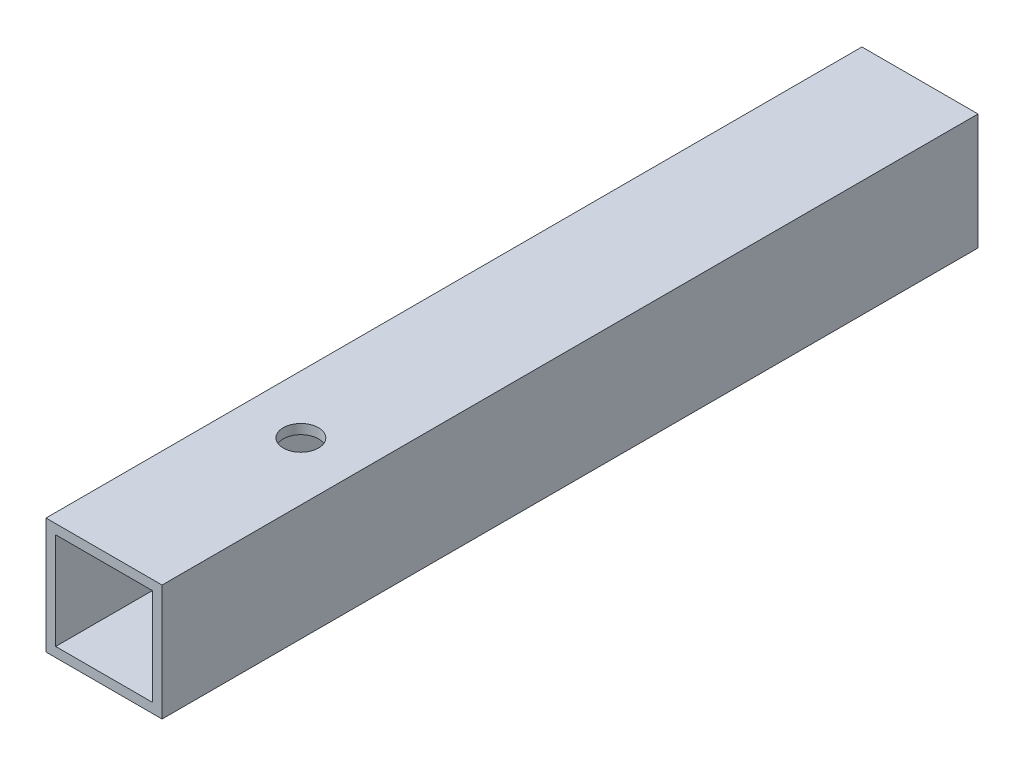
ISO-10303-21;
HEADER;
FILE_DESCRIPTION(('STEP AP214'),'2;1');
FILE_NAME('part.step','',(''),(''),'','','');
FILE_SCHEMA(('AUTOMOTIVE_DESIGN { 1 0 10303 214 1 1 1 1 }'));
ENDSEC;
DATA;
#1=APPLICATION_CONTEXT('core data for automotive mechanical design processes');
#2=APPLICATION_PROTOCOL_DEFINITION('international standard','automotive_design',2000,#1);
#3=PRODUCT_CONTEXT('',#1,'mechanical');
#4=PRODUCT('Part','Part','',(#3));
#5=PRODUCT_RELATED_PRODUCT_CATEGORY('part','',(#4));
#6=PRODUCT_DEFINITION_FORMATION('','',#4);
#7=PRODUCT_DEFINITION_CONTEXT('part definition',#1,'design');
#8=PRODUCT_DEFINITION('design','',#6,#7);
#9=PRODUCT_DEFINITION_SHAPE('','',#8);
#10=(LENGTH_UNIT() NAMED_UNIT(*) SI_UNIT(.MILLI.,.METRE.));
#11=(NAMED_UNIT(*) PLANE_ANGLE_UNIT() SI_UNIT($,.RADIAN.));
#12=(NAMED_UNIT(*) SI_UNIT($,.STERADIAN.) SOLID_ANGLE_UNIT());
#13=UNCERTAINTY_MEASURE_WITH_UNIT(LENGTH_MEASURE(1.E-05),#10,'distance_accuracy_value','');
#14=(GEOMETRIC_REPRESENTATION_CONTEXT(3) GLOBAL_UNCERTAINTY_ASSIGNED_CONTEXT((#13)) GLOBAL_UNIT_ASSIGNED_CONTEXT((#10,
#11,#12)) REPRESENTATION_CONTEXT('',''));
#15=CARTESIAN_POINT('',(0.,0.,0.));
#16=DIRECTION('',(0.,0.,1.));
#17=DIRECTION('',(1.,0.,0.));
#18=AXIS2_PLACEMENT_3D('',#15,#16,#17);
#19=CARTESIAN_POINT('',(0.,0.,66.951599904));
#20=DIRECTION('',(0.,0.,1.));
#21=DIRECTION('',(1.,0.,0.));
#22=AXIS2_PLACEMENT_3D('',#19,#20,#21);
#23=PLANE('',#22);
#24=DIRECTION('',(1.,0.,0.));
#25=VECTOR('',#24,1.);
#26=CARTESIAN_POINT('',(9.525,-9.525,66.951599904));
#27=LINE('',#26,#25);
#28=CARTESIAN_POINT('',(-9.525,-9.525,66.951599904));
#29=VERTEX_POINT('',#28);
#30=CARTESIAN_POINT('',(9.525,-9.525,66.951599904));
#31=VERTEX_POINT('',#30);
#32=EDGE_CURVE('E139',#29,#31,#27,.T.);
#33=ORIENTED_EDGE('',*,*,#32,.T.);
#34=DIRECTION('',(0.,1.,0.));
#35=VECTOR('',#34,1.);
#36=CARTESIAN_POINT('',(9.525,9.525,66.951599904));
#37=LINE('',#36,#35);
#38=CARTESIAN_POINT('',(9.525,9.525,66.951599904));
#39=VERTEX_POINT('',#38);
#40=EDGE_CURVE('E142',#31,#39,#37,.T.);
#41=ORIENTED_EDGE('',*,*,#40,.T.);
#42=DIRECTION('',(-1.,0.,0.));
#43=VECTOR('',#42,1.);
#44=CARTESIAN_POINT('',(9.525,9.525,66.951599904));
#45=LINE('',#44,#43);
#46=CARTESIAN_POINT('',(-9.525,9.525,66.951599904));
#47=VERTEX_POINT('',#46);
#48=EDGE_CURVE('E145',#39,#47,#45,.T.);
#49=ORIENTED_EDGE('',*,*,#48,.T.);
#50=DIRECTION('',(0.,-1.,0.));
#51=VECTOR('',#50,1.);
#52=CARTESIAN_POINT('',(-9.525,9.525,66.951599904));
#53=LINE('',#52,#51);
#54=EDGE_CURVE('E147',#47,#29,#53,.T.);
#55=ORIENTED_EDGE('',*,*,#54,.T.);
#56=EDGE_LOOP('',(#33,#41,#49,#55));
#57=FACE_BOUND('',#56,.T.);
#58=DIRECTION('',(0.,1.,0.));
#59=VECTOR('',#58,1.);
#60=CARTESIAN_POINT('',(7.9375,7.9375,66.951599904));
#61=LINE('',#60,#59);
#62=CARTESIAN_POINT('',(7.9375,-7.9375,66.951599904));
#63=VERTEX_POINT('',#62);
#64=CARTESIAN_POINT('',(7.9375,7.9375,66.951599904));
#65=VERTEX_POINT('',#64);
#66=EDGE_CURVE('E109',#63,#65,#61,.T.);
#67=ORIENTED_EDGE('',*,*,#66,.F.);
#68=DIRECTION('',(1.,0.,0.));
#69=VECTOR('',#68,1.);
#70=CARTESIAN_POINT('',(7.9375,-7.9375,66.951599904));
#71=LINE('',#70,#69);
#72=CARTESIAN_POINT('',(-7.9375,-7.9375,66.951599904));
#73=VERTEX_POINT('',#72);
#74=EDGE_CURVE('E101',#73,#63,#71,.T.);
#75=ORIENTED_EDGE('',*,*,#74,.F.);
#76=DIRECTION('',(0.,-1.,0.));
#77=VECTOR('',#76,1.);
#78=CARTESIAN_POINT('',(-7.9375,7.9375,66.951599904));
#79=LINE('',#78,#77);
#80=CARTESIAN_POINT('',(-7.9375,7.9375,66.951599904));
#81=VERTEX_POINT('',#80);
#82=EDGE_CURVE('E123',#81,#73,#79,.T.);
#83=ORIENTED_EDGE('',*,*,#82,.F.);
#84=DIRECTION('',(-1.,0.,0.));
#85=VECTOR('',#84,1.);
#86=CARTESIAN_POINT('',(7.9375,7.9375,66.951599904));
#87=LINE('',#86,#85);
#88=EDGE_CURVE('E121',#65,#81,#87,.T.);
#89=ORIENTED_EDGE('',*,*,#88,.F.);
#90=EDGE_LOOP('',(#67,#75,#83,#89));
#91=FACE_BOUND('',#90,.T.);
#92=ADVANCED_FACE('F35',(#57,#91),#23,.T.);
#93=CARTESIAN_POINT('',(0.,0.,-66.951599904));
#94=DIRECTION('',(0.,0.,1.));
#95=DIRECTION('',(1.,0.,0.));
#96=AXIS2_PLACEMENT_3D('',#93,#94,#95);
#97=PLANE('',#96);
#98=DIRECTION('',(1.,0.,0.));
#99=VECTOR('',#98,1.);
#100=CARTESIAN_POINT('',(9.525,-9.525,-66.951599904));
#101=LINE('',#100,#99);
#102=CARTESIAN_POINT('',(-9.525,-9.525,-66.951599904));
#103=VERTEX_POINT('',#102);
#104=CARTESIAN_POINT('',(9.525,-9.525,-66.951599904));
#105=VERTEX_POINT('',#104);
#106=EDGE_CURVE('E117',#103,#105,#101,.T.);
#107=ORIENTED_EDGE('',*,*,#106,.F.);
#108=DIRECTION('',(0.,-1.,0.));
#109=VECTOR('',#108,1.);
#110=CARTESIAN_POINT('',(-9.525,9.525,-66.951599904));
#111=LINE('',#110,#109);
#112=CARTESIAN_POINT('',(-9.525,9.525,-66.951599904));
#113=VERTEX_POINT('',#112);
#114=EDGE_CURVE('E143',#113,#103,#111,.T.);
#115=ORIENTED_EDGE('',*,*,#114,.F.);
#116=DIRECTION('',(-1.,0.,0.));
#117=VECTOR('',#116,1.);
#118=CARTESIAN_POINT('',(9.525,9.525,-66.951599904));
#119=LINE('',#118,#117);
#120=CARTESIAN_POINT('',(9.525,9.525,-66.951599904));
#121=VERTEX_POINT('',#120);
#122=EDGE_CURVE('E154',#121,#113,#119,.T.);
#123=ORIENTED_EDGE('',*,*,#122,.F.);
#124=DIRECTION('',(0.,1.,0.));
#125=VECTOR('',#124,1.);
#126=CARTESIAN_POINT('',(9.525,9.525,-66.951599904));
#127=LINE('',#126,#125);
#128=EDGE_CURVE('E152',#105,#121,#127,.T.);
#129=ORIENTED_EDGE('',*,*,#128,.F.);
#130=EDGE_LOOP('',(#107,#115,#123,#129));
#131=FACE_BOUND('',#130,.T.);
#132=DIRECTION('',(1.,0.,0.));
#133=VECTOR('',#132,1.);
#134=CARTESIAN_POINT('',(7.9375,-7.9375,-66.951599904));
#135=LINE('',#134,#133);
#136=CARTESIAN_POINT('',(-7.9375,-7.9375,-66.951599904));
#137=VERTEX_POINT('',#136);
#138=CARTESIAN_POINT('',(7.9375,-7.9375,-66.951599904));
#139=VERTEX_POINT('',#138);
#140=EDGE_CURVE('E59',#137,#139,#135,.T.);
#141=ORIENTED_EDGE('',*,*,#140,.T.);
#142=DIRECTION('',(0.,1.,0.));
#143=VECTOR('',#142,1.);
#144=CARTESIAN_POINT('',(7.9375,7.9375,-66.951599904));
#145=LINE('',#144,#143);
#146=CARTESIAN_POINT('',(7.9375,7.9375,-66.951599904));
#147=VERTEX_POINT('',#146);
#148=EDGE_CURVE('E116',#139,#147,#145,.T.);
#149=ORIENTED_EDGE('',*,*,#148,.T.);
#150=DIRECTION('',(-1.,0.,0.));
#151=VECTOR('',#150,1.);
#152=CARTESIAN_POINT('',(7.9375,7.9375,-66.951599904));
#153=LINE('',#152,#151);
#154=CARTESIAN_POINT('',(-7.9375,7.9375,-66.951599904));
#155=VERTEX_POINT('',#154);
#156=EDGE_CURVE('E131',#147,#155,#153,.T.);
#157=ORIENTED_EDGE('',*,*,#156,.T.);
#158=DIRECTION('',(0.,-1.,0.));
#159=VECTOR('',#158,1.);
#160=CARTESIAN_POINT('',(-7.9375,7.9375,-66.951599904));
#161=LINE('',#160,#159);
#162=EDGE_CURVE('E110',#155,#137,#161,.T.);
#163=ORIENTED_EDGE('',*,*,#162,.T.);
#164=EDGE_LOOP('',(#141,#149,#157,#163));
#165=FACE_BOUND('',#164,.T.);
#166=ADVANCED_FACE('F173',(#131,#165),#97,.F.);
#167=CARTESIAN_POINT('',(9.525,-9.525,66.951599904));
#168=DIRECTION('',(0.,1.,0.));
#169=DIRECTION('',(-1.,0.,0.));
#170=AXIS2_PLACEMENT_3D('',#167,#168,#169);
#171=PLANE('',#170);
#172=CARTESIAN_POINT('',(0.,-9.52500000000001,34.648400096));
#173=DIRECTION('',(0.,1.,0.));
#174=DIRECTION('',(-1.,0.,0.));
#175=AXIS2_PLACEMENT_3D('',#172,#173,#174);
#176=CIRCLE('',#175,2.8956);
#177=CARTESIAN_POINT('',(-2.8956,-9.52500000000001,34.648400096));
#178=VERTEX_POINT('',#177);
#179=EDGE_CURVE('E214',#178,#178,#176,.T.);
#180=ORIENTED_EDGE('',*,*,#179,.T.);
#181=EDGE_LOOP('',(#180));
#182=FACE_BOUND('',#181,.T.);
#183=ORIENTED_EDGE('',*,*,#106,.T.);
#184=DIRECTION('',(0.,0.,-1.));
#185=VECTOR('',#184,1.);
#186=CARTESIAN_POINT('',(9.525,-9.525,66.951599904));
#187=LINE('',#186,#185);
#188=EDGE_CURVE('E11',#31,#105,#187,.T.);
#189=ORIENTED_EDGE('',*,*,#188,.F.);
#190=ORIENTED_EDGE('',*,*,#32,.F.);
#191=DIRECTION('',(0.,0.,-1.));
#192=VECTOR('',#191,1.);
#193=CARTESIAN_POINT('',(-9.525,-9.525,66.951599904));
#194=LINE('',#193,#192);
#195=EDGE_CURVE('E149',#29,#103,#194,.T.);
#196=ORIENTED_EDGE('',*,*,#195,.T.);
#197=EDGE_LOOP('',(#183,#189,#190,#196));
#198=FACE_BOUND('',#197,.T.);
#199=ADVANCED_FACE('F37',(#182,#198),#171,.F.);
#200=CARTESIAN_POINT('',(9.525,9.525,66.951599904));
#201=DIRECTION('',(-1.,0.,0.));
#202=DIRECTION('',(0.,0.,1.));
#203=AXIS2_PLACEMENT_3D('',#200,#201,#202);
#204=PLANE('',#203);
#205=ORIENTED_EDGE('',*,*,#128,.T.);
#206=DIRECTION('',(0.,0.,-1.));
#207=VECTOR('',#206,1.);
#208=CARTESIAN_POINT('',(9.525,9.525,66.951599904));
#209=LINE('',#208,#207);
#210=EDGE_CURVE('E44',#39,#121,#209,.T.);
#211=ORIENTED_EDGE('',*,*,#210,.F.);
#212=ORIENTED_EDGE('',*,*,#40,.F.);
#213=ORIENTED_EDGE('',*,*,#188,.T.);
#214=EDGE_LOOP('',(#205,#211,#212,#213));
#215=FACE_BOUND('',#214,.T.);
#216=ADVANCED_FACE('F183',(#215),#204,.F.);
#217=CARTESIAN_POINT('',(9.525,9.525,66.951599904));
#218=DIRECTION('',(0.,-1.,0.));
#219=DIRECTION('',(1.,0.,0.));
#220=AXIS2_PLACEMENT_3D('',#217,#218,#219);
#221=PLANE('',#220);
#222=CARTESIAN_POINT('',(0.,9.525,34.648400096));
#223=DIRECTION('',(0.,1.,0.));
#224=DIRECTION('',(-1.,0.,0.));
#225=AXIS2_PLACEMENT_3D('',#222,#223,#224);
#226=CIRCLE('',#225,2.8956);
#227=CARTESIAN_POINT('',(-2.8956,9.525,34.648400096));
#228=VERTEX_POINT('',#227);
#229=EDGE_CURVE('E216',#228,#228,#226,.T.);
#230=ORIENTED_EDGE('',*,*,#229,.F.);
#231=EDGE_LOOP('',(#230));
#232=FACE_BOUND('',#231,.T.);
#233=ORIENTED_EDGE('',*,*,#122,.T.);
#234=DIRECTION('',(0.,0.,-1.));
#235=VECTOR('',#234,1.);
#236=CARTESIAN_POINT('',(-9.525,9.525,66.951599904));
#237=LINE('',#236,#235);
#238=EDGE_CURVE('E159',#47,#113,#237,.T.);
#239=ORIENTED_EDGE('',*,*,#238,.F.);
#240=ORIENTED_EDGE('',*,*,#48,.F.);
#241=ORIENTED_EDGE('',*,*,#210,.T.);
#242=EDGE_LOOP('',(#233,#239,#240,#241));
#243=FACE_BOUND('',#242,.T.);
#244=ADVANCED_FACE('F167',(#232,#243),#221,.F.);
#245=CARTESIAN_POINT('',(-9.525,9.525,66.951599904));
#246=DIRECTION('',(1.,0.,0.));
#247=DIRECTION('',(0.,0.,-1.));
#248=AXIS2_PLACEMENT_3D('',#245,#246,#247);
#249=PLANE('',#248);
#250=ORIENTED_EDGE('',*,*,#114,.T.);
#251=ORIENTED_EDGE('',*,*,#195,.F.);
#252=ORIENTED_EDGE('',*,*,#54,.F.);
#253=ORIENTED_EDGE('',*,*,#238,.T.);
#254=EDGE_LOOP('',(#250,#251,#252,#253));
#255=FACE_BOUND('',#254,.T.);
#256=ADVANCED_FACE('F177',(#255),#249,.F.);
#257=CARTESIAN_POINT('',(7.9375,-7.9375,66.951599904));
#258=DIRECTION('',(0.,1.,0.));
#259=DIRECTION('',(-1.,0.,0.));
#260=AXIS2_PLACEMENT_3D('',#257,#258,#259);
#261=PLANE('',#260);
#262=CARTESIAN_POINT('',(0.,-7.9375,34.648400096));
#263=DIRECTION('',(0.,1.,0.));
#264=DIRECTION('',(-1.,0.,0.));
#265=AXIS2_PLACEMENT_3D('',#262,#263,#264);
#266=CIRCLE('',#265,2.8956);
#267=CARTESIAN_POINT('',(-2.8956,-7.9375,34.648400096));
#268=VERTEX_POINT('',#267);
#269=EDGE_CURVE('E129',#268,#268,#266,.T.);
#270=ORIENTED_EDGE('',*,*,#269,.F.);
#271=EDGE_LOOP('',(#270));
#272=FACE_BOUND('',#271,.T.);
#273=ORIENTED_EDGE('',*,*,#140,.F.);
#274=DIRECTION('',(0.,0.,-1.));
#275=VECTOR('',#274,1.);
#276=CARTESIAN_POINT('',(-7.9375,-7.9375,66.951599904));
#277=LINE('',#276,#275);
#278=EDGE_CURVE('E105',#73,#137,#277,.T.);
#279=ORIENTED_EDGE('',*,*,#278,.F.);
#280=ORIENTED_EDGE('',*,*,#74,.T.);
#281=DIRECTION('',(0.,0.,-1.));
#282=VECTOR('',#281,1.);
#283=CARTESIAN_POINT('',(7.9375,-7.9375,66.951599904));
#284=LINE('',#283,#282);
#285=EDGE_CURVE('E104',#63,#139,#284,.T.);
#286=ORIENTED_EDGE('',*,*,#285,.T.);
#287=EDGE_LOOP('',(#273,#279,#280,#286));
#288=FACE_BOUND('',#287,.T.);
#289=ADVANCED_FACE('F103',(#272,#288),#261,.T.);
#290=CARTESIAN_POINT('',(7.9375,7.9375,66.951599904));
#291=DIRECTION('',(-1.,0.,0.));
#292=DIRECTION('',(0.,0.,1.));
#293=AXIS2_PLACEMENT_3D('',#290,#291,#292);
#294=PLANE('',#293);
#295=ORIENTED_EDGE('',*,*,#148,.F.);
#296=ORIENTED_EDGE('',*,*,#285,.F.);
#297=ORIENTED_EDGE('',*,*,#66,.T.);
#298=DIRECTION('',(0.,0.,-1.));
#299=VECTOR('',#298,1.);
#300=CARTESIAN_POINT('',(7.9375,7.9375,66.951599904));
#301=LINE('',#300,#299);
#302=EDGE_CURVE('E118',#65,#147,#301,.T.);
#303=ORIENTED_EDGE('',*,*,#302,.T.);
#304=EDGE_LOOP('',(#295,#296,#297,#303));
#305=FACE_BOUND('',#304,.T.);
#306=ADVANCED_FACE('F113',(#305),#294,.T.);
#307=CARTESIAN_POINT('',(7.9375,7.9375,66.951599904));
#308=DIRECTION('',(0.,-1.,0.));
#309=DIRECTION('',(1.,0.,0.));
#310=AXIS2_PLACEMENT_3D('',#307,#308,#309);
#311=PLANE('',#310);
#312=CARTESIAN_POINT('',(0.,7.9375,34.648400096));
#313=DIRECTION('',(0.,-1.,0.));
#314=DIRECTION('',(1.,0.,0.));
#315=AXIS2_PLACEMENT_3D('',#312,#313,#314);
#316=CIRCLE('',#315,2.8956);
#317=CARTESIAN_POINT('',(2.8956,7.9375,34.648400096));
#318=VERTEX_POINT('',#317);
#319=EDGE_CURVE('E39',#318,#318,#316,.T.);
#320=ORIENTED_EDGE('',*,*,#319,.F.);
#321=EDGE_LOOP('',(#320));
#322=FACE_BOUND('',#321,.T.);
#323=ORIENTED_EDGE('',*,*,#156,.F.);
#324=ORIENTED_EDGE('',*,*,#302,.F.);
#325=ORIENTED_EDGE('',*,*,#88,.T.);
#326=DIRECTION('',(0.,0.,-1.));
#327=VECTOR('',#326,1.);
#328=CARTESIAN_POINT('',(-7.9375,7.9375,66.951599904));
#329=LINE('',#328,#327);
#330=EDGE_CURVE('E51',#81,#155,#329,.T.);
#331=ORIENTED_EDGE('',*,*,#330,.T.);
#332=EDGE_LOOP('',(#323,#324,#325,#331));
#333=FACE_BOUND('',#332,.T.);
#334=ADVANCED_FACE('F209',(#322,#333),#311,.T.);
#335=CARTESIAN_POINT('',(-7.9375,7.9375,66.951599904));
#336=DIRECTION('',(1.,0.,0.));
#337=DIRECTION('',(0.,0.,-1.));
#338=AXIS2_PLACEMENT_3D('',#335,#336,#337);
#339=PLANE('',#338);
#340=ORIENTED_EDGE('',*,*,#162,.F.);
#341=ORIENTED_EDGE('',*,*,#330,.F.);
#342=ORIENTED_EDGE('',*,*,#82,.T.);
#343=ORIENTED_EDGE('',*,*,#278,.T.);
#344=EDGE_LOOP('',(#340,#341,#342,#343));
#345=FACE_BOUND('',#344,.T.);
#346=ADVANCED_FACE('F229',(#345),#339,.T.);
#347=CARTESIAN_POINT('',(0.,-9.52500000000001,34.648400096));
#348=DIRECTION('',(0.,1.,0.));
#349=DIRECTION('',(-1.,0.,0.));
#350=AXIS2_PLACEMENT_3D('',#347,#348,#349);
#351=CYLINDRICAL_SURFACE('',#350,2.8956);
#352=ORIENTED_EDGE('',*,*,#319,.T.);
#353=EDGE_LOOP('',(#352));
#354=FACE_BOUND('',#353,.T.);
#355=ORIENTED_EDGE('',*,*,#229,.T.);
#356=EDGE_LOOP('',(#355));
#357=FACE_BOUND('',#356,.T.);
#358=ADVANCED_FACE('F224',(#354,#357),#351,.F.);
#359=ORIENTED_EDGE('',*,*,#269,.T.);
#360=EDGE_LOOP('',(#359));
#361=FACE_BOUND('',#360,.T.);
#362=ORIENTED_EDGE('',*,*,#179,.F.);
#363=EDGE_LOOP('',(#362));
#364=FACE_BOUND('',#363,.T.);
#365=ADVANCED_FACE('F222',(#361,#364),#351,.F.);
#366=CLOSED_SHELL('',(#92,#166,#199,#216,#244,#256,#289,#306,#334,#346,#358,#365));
#367=MANIFOLD_SOLID_BREP('B2',#366);
#368=ADVANCED_BREP_SHAPE_REPRESENTATION('',(#18,#367),#14);
#369=SHAPE_DEFINITION_REPRESENTATION(#9,#368);
ENDSEC;
END-ISO-10303-21;
